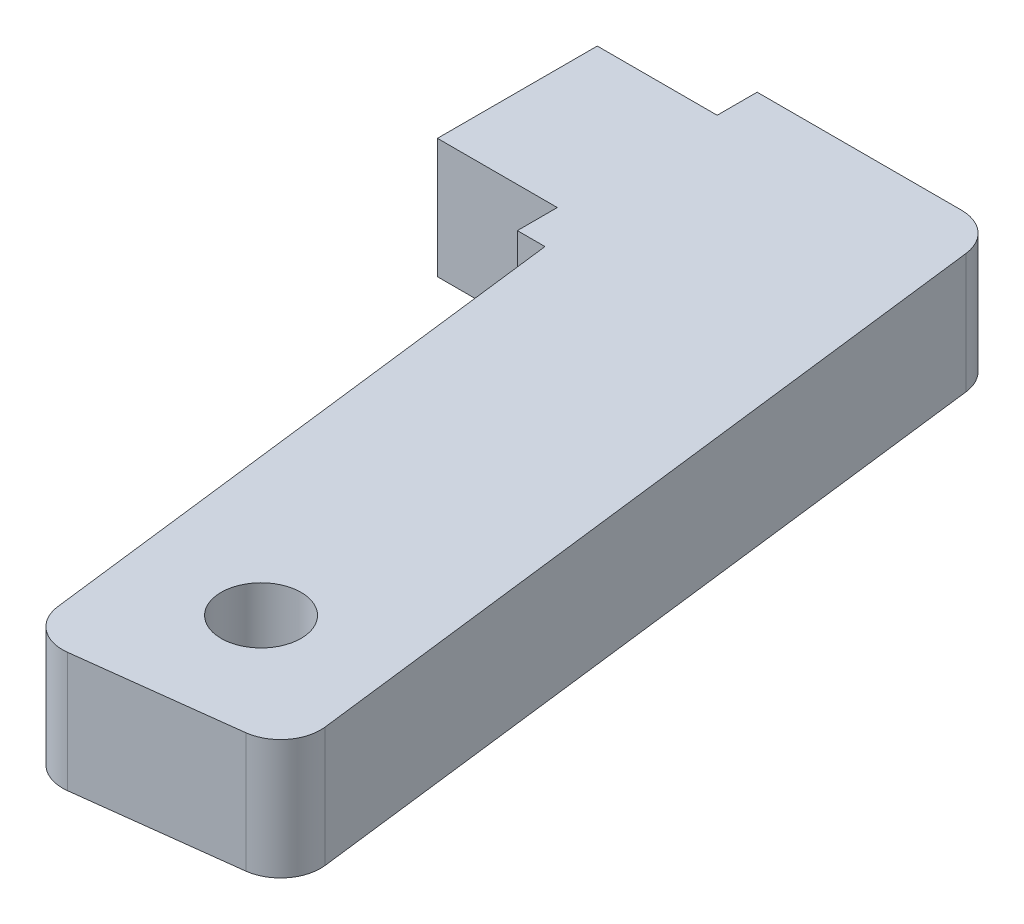
ISO-10303-21;
HEADER;
FILE_DESCRIPTION(('STEP AP214'),'2;1');
FILE_NAME('part.step','',(''),(''),'','','');
FILE_SCHEMA(('AUTOMOTIVE_DESIGN { 1 0 10303 214 1 1 1 1 }'));
ENDSEC;
DATA;
#1=APPLICATION_CONTEXT('core data for automotive mechanical design processes');
#2=APPLICATION_PROTOCOL_DEFINITION('international standard','automotive_design',2000,#1);
#3=PRODUCT_CONTEXT('',#1,'mechanical');
#4=PRODUCT('Part','Part','',(#3));
#5=PRODUCT_RELATED_PRODUCT_CATEGORY('part','',(#4));
#6=PRODUCT_DEFINITION_FORMATION('','',#4);
#7=PRODUCT_DEFINITION_CONTEXT('part definition',#1,'design');
#8=PRODUCT_DEFINITION('design','',#6,#7);
#9=PRODUCT_DEFINITION_SHAPE('','',#8);
#10=(LENGTH_UNIT() NAMED_UNIT(*) SI_UNIT(.MILLI.,.METRE.));
#11=(NAMED_UNIT(*) PLANE_ANGLE_UNIT() SI_UNIT($,.RADIAN.));
#12=(NAMED_UNIT(*) SI_UNIT($,.STERADIAN.) SOLID_ANGLE_UNIT());
#13=UNCERTAINTY_MEASURE_WITH_UNIT(LENGTH_MEASURE(1.E-05),#10,'distance_accuracy_value','');
#14=(GEOMETRIC_REPRESENTATION_CONTEXT(3) GLOBAL_UNCERTAINTY_ASSIGNED_CONTEXT((#13)) GLOBAL_UNIT_ASSIGNED_CONTEXT((#10,
#11,#12)) REPRESENTATION_CONTEXT('',''));
#15=CARTESIAN_POINT('',(0.,0.,0.));
#16=DIRECTION('',(0.,0.,1.));
#17=DIRECTION('',(1.,0.,0.));
#18=AXIS2_PLACEMENT_3D('',#15,#16,#17);
#19=CARTESIAN_POINT('',(0.,3.,0.));
#20=DIRECTION('',(0.,-1.,0.));
#21=DIRECTION('',(0.,0.,-1.));
#22=AXIS2_PLACEMENT_3D('',#19,#20,#21);
#23=PLANE('',#22);
#24=DIRECTION('',(0.121869343405144,0.,0.992546151641322));
#25=VECTOR('',#24,1.);
#26=CARTESIAN_POINT('',(15.4398871595285,3.,-13.9333416231385));
#27=LINE('',#26,#25);
#28=CARTESIAN_POINT('',(15.4398871595285,3.,-13.9333416231385));
#29=VERTEX_POINT('',#28);
#30=CARTESIAN_POINT('',(17.1460579672006,3.,-0.0376955001600201));
#31=VERTEX_POINT('',#30);
#32=EDGE_CURVE('E288',#29,#31,#27,.T.);
#33=ORIENTED_EDGE('',*,*,#32,.T.);
#34=CARTESIAN_POINT('',(18.1386041188419,3.,-0.159564843565165));
#35=DIRECTION('',(0.,-1.,0.));
#36=DIRECTION('',(0.,0.,-1.));
#37=AXIS2_PLACEMENT_3D('',#34,#35,#36);
#38=CIRCLE('',#37,1.);
#39=CARTESIAN_POINT('',(18.260473462247,3.,0.832981308076158));
#40=VERTEX_POINT('',#39);
#41=EDGE_CURVE('E199',#31,#40,#38,.F.);
#42=ORIENTED_EDGE('',*,*,#41,.T.);
#43=DIRECTION('',(0.992546151641322,0.,-0.121869343405144));
#44=VECTOR('',#43,1.);
#45=CARTESIAN_POINT('',(17.2679273106057,3.,0.954850651481302));
#46=LINE('',#45,#44);
#47=CARTESIAN_POINT('',(22.2306580688123,3.,0.34550393445558));
#48=VERTEX_POINT('',#47);
#49=EDGE_CURVE('E287',#40,#48,#46,.T.);
#50=ORIENTED_EDGE('',*,*,#49,.T.);
#51=CARTESIAN_POINT('',(22.1087887254072,3.,-0.647042217185743));
#52=DIRECTION('',(0.,-1.,0.));
#53=DIRECTION('',(0.,0.,-1.));
#54=AXIS2_PLACEMENT_3D('',#51,#52,#53);
#55=CIRCLE('',#54,1.);
#56=CARTESIAN_POINT('',(23.1013348770485,3.,-0.768911560590887));
#57=VERTEX_POINT('',#56);
#58=EDGE_CURVE('E196',#48,#57,#55,.F.);
#59=ORIENTED_EDGE('',*,*,#58,.T.);
#60=DIRECTION('',(-0.121869343405145,0.,-0.992546151641322));
#61=VECTOR('',#60,1.);
#62=CARTESIAN_POINT('',(23.2232042204536,3.,0.223634591050435));
#63=LINE('',#62,#61);
#64=CARTESIAN_POINT('',(20.8560596339496,3.,-19.0552109665437));
#65=VERTEX_POINT('',#64);
#66=EDGE_CURVE('E211',#57,#65,#63,.T.);
#67=ORIENTED_EDGE('',*,*,#66,.T.);
#68=CARTESIAN_POINT('',(19.8635134823083,3.,-18.9333416231385));
#69=DIRECTION('',(0.,-1.,0.));
#70=DIRECTION('',(0.,0.,-1.));
#71=AXIS2_PLACEMENT_3D('',#68,#69,#70);
#72=CIRCLE('',#71,1.);
#73=CARTESIAN_POINT('',(19.8635134823083,3.,-19.9333416231385));
#74=VERTEX_POINT('',#73);
#75=EDGE_CURVE('E59',#65,#74,#72,.F.);
#76=ORIENTED_EDGE('',*,*,#75,.T.);
#77=DIRECTION('',(-1.,0.,0.));
#78=VECTOR('',#77,1.);
#79=CARTESIAN_POINT('',(20.7482387468642,3.,-19.9333416231385));
#80=LINE('',#79,#78);
#81=CARTESIAN_POINT('',(14.7482387468642,3.,-19.9333416231385));
#82=VERTEX_POINT('',#81);
#83=EDGE_CURVE('E157',#74,#82,#80,.T.);
#84=ORIENTED_EDGE('',*,*,#83,.T.);
#85=DIRECTION('',(0.,0.,1.));
#86=VECTOR('',#85,1.);
#87=CARTESIAN_POINT('',(14.7482387468642,3.,-19.9333416231385));
#88=LINE('',#87,#86);
#89=CARTESIAN_POINT('',(14.7482387468642,3.,-18.9333416231385));
#90=VERTEX_POINT('',#89);
#91=EDGE_CURVE('E152',#82,#90,#88,.T.);
#92=ORIENTED_EDGE('',*,*,#91,.T.);
#93=DIRECTION('',(-1.,0.,0.));
#94=VECTOR('',#93,1.);
#95=CARTESIAN_POINT('',(14.7482387468642,3.,-18.9333416231385));
#96=LINE('',#95,#94);
#97=CARTESIAN_POINT('',(11.7482387468642,3.,-18.9333416231385));
#98=VERTEX_POINT('',#97);
#99=EDGE_CURVE('E141',#90,#98,#96,.T.);
#100=ORIENTED_EDGE('',*,*,#99,.T.);
#101=DIRECTION('',(0.,0.,1.));
#102=VECTOR('',#101,1.);
#103=CARTESIAN_POINT('',(11.7482387468642,3.,-18.9333416231385));
#104=LINE('',#103,#102);
#105=CARTESIAN_POINT('',(11.7482387468642,3.,-14.9333416231385));
#106=VERTEX_POINT('',#105);
#107=EDGE_CURVE('E151',#98,#106,#104,.T.);
#108=ORIENTED_EDGE('',*,*,#107,.T.);
#109=DIRECTION('',(1.,0.,0.));
#110=VECTOR('',#109,1.);
#111=CARTESIAN_POINT('',(11.7482387468642,3.,-14.9333416231385));
#112=LINE('',#111,#110);
#113=CARTESIAN_POINT('',(14.7482387468642,3.,-14.9333416231385));
#114=VERTEX_POINT('',#113);
#115=EDGE_CURVE('E254',#106,#114,#112,.T.);
#116=ORIENTED_EDGE('',*,*,#115,.T.);
#117=DIRECTION('',(0.,0.,1.));
#118=VECTOR('',#117,1.);
#119=CARTESIAN_POINT('',(14.7482387468642,3.,-14.9333416231385));
#120=LINE('',#119,#118);
#121=CARTESIAN_POINT('',(14.7482387468642,3.,-13.9333416231385));
#122=VERTEX_POINT('',#121);
#123=EDGE_CURVE('E309',#114,#122,#120,.T.);
#124=ORIENTED_EDGE('',*,*,#123,.T.);
#125=DIRECTION('',(1.,0.,0.));
#126=VECTOR('',#125,1.);
#127=CARTESIAN_POINT('',(14.7482387468642,3.,-13.9333416231385));
#128=LINE('',#127,#126);
#129=EDGE_CURVE('E298',#122,#29,#128,.T.);
#130=ORIENTED_EDGE('',*,*,#129,.T.);
#131=EDGE_LOOP('',(#33,#42,#50,#59,#67,#76,#84,#92,#100,#108,#116,#124,#130));
#132=FACE_BOUND('',#131,.T.);
#133=CARTESIAN_POINT('',(19.8799577353142,3.,-2.3883958336581));
#134=DIRECTION('',(0.,1.,0.));
#135=DIRECTION('',(0.,0.,1.));
#136=AXIS2_PLACEMENT_3D('',#133,#134,#135);
#137=CIRCLE('',#136,1.);
#138=CARTESIAN_POINT('',(19.8799577353142,3.,-1.3883958336581));
#139=VERTEX_POINT('',#138);
#140=EDGE_CURVE('E304',#139,#139,#137,.T.);
#141=ORIENTED_EDGE('',*,*,#140,.F.);
#142=EDGE_LOOP('',(#141));
#143=FACE_BOUND('',#142,.T.);
#144=ADVANCED_FACE('F43',(#132,#143),#23,.F.);
#145=CARTESIAN_POINT('',(0.,0.,0.));
#146=DIRECTION('',(0.,-1.,0.));
#147=DIRECTION('',(0.,0.,-1.));
#148=AXIS2_PLACEMENT_3D('',#145,#146,#147);
#149=PLANE('',#148);
#150=DIRECTION('',(0.992546151641322,0.,-0.121869343405144));
#151=VECTOR('',#150,1.);
#152=CARTESIAN_POINT('',(17.2679273106057,0.,0.954850651481302));
#153=LINE('',#152,#151);
#154=CARTESIAN_POINT('',(18.260473462247,0.,0.832981308076158));
#155=VERTEX_POINT('',#154);
#156=CARTESIAN_POINT('',(22.2306580688123,0.,0.34550393445558));
#157=VERTEX_POINT('',#156);
#158=EDGE_CURVE('E220',#155,#157,#153,.T.);
#159=ORIENTED_EDGE('',*,*,#158,.F.);
#160=CARTESIAN_POINT('',(18.1386041188419,0.,-0.159564843565165));
#161=DIRECTION('',(0.,-1.,0.));
#162=DIRECTION('',(0.,0.,-1.));
#163=AXIS2_PLACEMENT_3D('',#160,#161,#162);
#164=CIRCLE('',#163,1.);
#165=CARTESIAN_POINT('',(17.1460579672006,0.,-0.0376955001600201));
#166=VERTEX_POINT('',#165);
#167=EDGE_CURVE('E188',#155,#166,#164,.T.);
#168=ORIENTED_EDGE('',*,*,#167,.T.);
#169=DIRECTION('',(0.121869343405144,0.,0.992546151641322));
#170=VECTOR('',#169,1.);
#171=CARTESIAN_POINT('',(15.4398871595285,0.,-13.9333416231385));
#172=LINE('',#171,#170);
#173=CARTESIAN_POINT('',(15.4398871595285,0.,-13.9333416231385));
#174=VERTEX_POINT('',#173);
#175=EDGE_CURVE('E225',#174,#166,#172,.T.);
#176=ORIENTED_EDGE('',*,*,#175,.F.);
#177=DIRECTION('',(1.,0.,0.));
#178=VECTOR('',#177,1.);
#179=CARTESIAN_POINT('',(14.7482387468642,0.,-13.9333416231385));
#180=LINE('',#179,#178);
#181=CARTESIAN_POINT('',(14.7482387468642,0.,-13.9333416231385));
#182=VERTEX_POINT('',#181);
#183=EDGE_CURVE('E265',#182,#174,#180,.T.);
#184=ORIENTED_EDGE('',*,*,#183,.F.);
#185=DIRECTION('',(0.,0.,1.));
#186=VECTOR('',#185,1.);
#187=CARTESIAN_POINT('',(14.7482387468642,0.,-14.9333416231385));
#188=LINE('',#187,#186);
#189=CARTESIAN_POINT('',(14.7482387468642,0.,-14.9333416231385));
#190=VERTEX_POINT('',#189);
#191=EDGE_CURVE('E260',#190,#182,#188,.T.);
#192=ORIENTED_EDGE('',*,*,#191,.F.);
#193=DIRECTION('',(1.,0.,0.));
#194=VECTOR('',#193,1.);
#195=CARTESIAN_POINT('',(11.7482387468642,0.,-14.9333416231385));
#196=LINE('',#195,#194);
#197=CARTESIAN_POINT('',(11.7482387468642,0.,-14.9333416231385));
#198=VERTEX_POINT('',#197);
#199=EDGE_CURVE('E253',#198,#190,#196,.T.);
#200=ORIENTED_EDGE('',*,*,#199,.F.);
#201=DIRECTION('',(0.,0.,1.));
#202=VECTOR('',#201,1.);
#203=CARTESIAN_POINT('',(11.7482387468642,0.,-18.9333416231385));
#204=LINE('',#203,#202);
#205=CARTESIAN_POINT('',(11.7482387468642,0.,-18.9333416231385));
#206=VERTEX_POINT('',#205);
#207=EDGE_CURVE('E258',#206,#198,#204,.T.);
#208=ORIENTED_EDGE('',*,*,#207,.F.);
#209=DIRECTION('',(-1.,0.,0.));
#210=VECTOR('',#209,1.);
#211=CARTESIAN_POINT('',(14.7482387468642,0.,-18.9333416231385));
#212=LINE('',#211,#210);
#213=CARTESIAN_POINT('',(14.7482387468642,0.,-18.9333416231385));
#214=VERTEX_POINT('',#213);
#215=EDGE_CURVE('E268',#214,#206,#212,.T.);
#216=ORIENTED_EDGE('',*,*,#215,.F.);
#217=DIRECTION('',(0.,0.,1.));
#218=VECTOR('',#217,1.);
#219=CARTESIAN_POINT('',(14.7482387468642,0.,-19.9333416231385));
#220=LINE('',#219,#218);
#221=CARTESIAN_POINT('',(14.7482387468642,0.,-19.9333416231385));
#222=VERTEX_POINT('',#221);
#223=EDGE_CURVE('E166',#222,#214,#220,.T.);
#224=ORIENTED_EDGE('',*,*,#223,.F.);
#225=DIRECTION('',(-1.,0.,0.));
#226=VECTOR('',#225,1.);
#227=CARTESIAN_POINT('',(20.7482387468642,0.,-19.9333416231385));
#228=LINE('',#227,#226);
#229=CARTESIAN_POINT('',(19.8635134823083,0.,-19.9333416231385));
#230=VERTEX_POINT('',#229);
#231=EDGE_CURVE('E162',#230,#222,#228,.T.);
#232=ORIENTED_EDGE('',*,*,#231,.F.);
#233=CARTESIAN_POINT('',(19.8635134823083,0.,-18.9333416231385));
#234=DIRECTION('',(0.,-1.,0.));
#235=DIRECTION('',(0.,0.,-1.));
#236=AXIS2_PLACEMENT_3D('',#233,#234,#235);
#237=CIRCLE('',#236,1.);
#238=CARTESIAN_POINT('',(20.8560596339496,0.,-19.0552109665437));
#239=VERTEX_POINT('',#238);
#240=EDGE_CURVE('E182',#230,#239,#237,.T.);
#241=ORIENTED_EDGE('',*,*,#240,.T.);
#242=DIRECTION('',(-0.121869343405145,0.,-0.992546151641322));
#243=VECTOR('',#242,1.);
#244=CARTESIAN_POINT('',(23.2232042204536,0.,0.223634591050435));
#245=LINE('',#244,#243);
#246=CARTESIAN_POINT('',(23.1013348770485,0.,-0.768911560590887));
#247=VERTEX_POINT('',#246);
#248=EDGE_CURVE('E210',#247,#239,#245,.T.);
#249=ORIENTED_EDGE('',*,*,#248,.F.);
#250=CARTESIAN_POINT('',(22.1087887254072,0.,-0.647042217185743));
#251=DIRECTION('',(0.,-1.,0.));
#252=DIRECTION('',(0.,0.,-1.));
#253=AXIS2_PLACEMENT_3D('',#250,#251,#252);
#254=CIRCLE('',#253,1.);
#255=EDGE_CURVE('E185',#247,#157,#254,.T.);
#256=ORIENTED_EDGE('',*,*,#255,.T.);
#257=EDGE_LOOP('',(#159,#168,#176,#184,#192,#200,#208,#216,#224,#232,#241,#249,#256));
#258=FACE_BOUND('',#257,.T.);
#259=CARTESIAN_POINT('',(19.8799577353142,0.,-2.3883958336581));
#260=DIRECTION('',(0.,1.,0.));
#261=DIRECTION('',(0.,0.,1.));
#262=AXIS2_PLACEMENT_3D('',#259,#260,#261);
#263=CIRCLE('',#262,1.);
#264=CARTESIAN_POINT('',(19.8799577353142,0.,-1.3883958336581));
#265=VERTEX_POINT('',#264);
#266=EDGE_CURVE('E473',#265,#265,#263,.T.);
#267=ORIENTED_EDGE('',*,*,#266,.T.);
#268=EDGE_LOOP('',(#267));
#269=FACE_BOUND('',#268,.T.);
#270=ADVANCED_FACE('F216',(#258,#269),#149,.T.);
#271=CARTESIAN_POINT('',(14.7482387468642,3.,-19.9333416231385));
#272=DIRECTION('',(1.,0.,0.));
#273=DIRECTION('',(0.,0.,-1.));
#274=AXIS2_PLACEMENT_3D('',#271,#272,#273);
#275=PLANE('',#274);
#276=ORIENTED_EDGE('',*,*,#223,.T.);
#277=DIRECTION('',(0.,-1.,0.));
#278=VECTOR('',#277,1.);
#279=CARTESIAN_POINT('',(14.7482387468642,3.,-18.9333416231385));
#280=LINE('',#279,#278);
#281=EDGE_CURVE('E145',#90,#214,#280,.T.);
#282=ORIENTED_EDGE('',*,*,#281,.F.);
#283=ORIENTED_EDGE('',*,*,#91,.F.);
#284=DIRECTION('',(0.,-1.,0.));
#285=VECTOR('',#284,1.);
#286=CARTESIAN_POINT('',(14.7482387468642,3.,-19.9333416231385));
#287=LINE('',#286,#285);
#288=EDGE_CURVE('E229',#82,#222,#287,.T.);
#289=ORIENTED_EDGE('',*,*,#288,.T.);
#290=EDGE_LOOP('',(#276,#282,#283,#289));
#291=FACE_BOUND('',#290,.T.);
#292=ADVANCED_FACE('F164',(#291),#275,.F.);
#293=CARTESIAN_POINT('',(14.7482387468642,3.,-18.9333416231385));
#294=DIRECTION('',(0.,0.,1.));
#295=DIRECTION('',(1.,0.,0.));
#296=AXIS2_PLACEMENT_3D('',#293,#294,#295);
#297=PLANE('',#296);
#298=ORIENTED_EDGE('',*,*,#215,.T.);
#299=DIRECTION('',(0.,-1.,0.));
#300=VECTOR('',#299,1.);
#301=CARTESIAN_POINT('',(11.7482387468642,3.,-18.9333416231385));
#302=LINE('',#301,#300);
#303=EDGE_CURVE('E148',#98,#206,#302,.T.);
#304=ORIENTED_EDGE('',*,*,#303,.F.);
#305=ORIENTED_EDGE('',*,*,#99,.F.);
#306=ORIENTED_EDGE('',*,*,#281,.T.);
#307=EDGE_LOOP('',(#298,#304,#305,#306));
#308=FACE_BOUND('',#307,.T.);
#309=ADVANCED_FACE('F143',(#308),#297,.F.);
#310=CARTESIAN_POINT('',(11.7482387468642,3.,-18.9333416231385));
#311=DIRECTION('',(1.,0.,0.));
#312=DIRECTION('',(0.,0.,-1.));
#313=AXIS2_PLACEMENT_3D('',#310,#311,#312);
#314=PLANE('',#313);
#315=ORIENTED_EDGE('',*,*,#207,.T.);
#316=DIRECTION('',(0.,-1.,0.));
#317=VECTOR('',#316,1.);
#318=CARTESIAN_POINT('',(11.7482387468642,3.,-14.9333416231385));
#319=LINE('',#318,#317);
#320=EDGE_CURVE('E175',#106,#198,#319,.T.);
#321=ORIENTED_EDGE('',*,*,#320,.F.);
#322=ORIENTED_EDGE('',*,*,#107,.F.);
#323=ORIENTED_EDGE('',*,*,#303,.T.);
#324=EDGE_LOOP('',(#315,#321,#322,#323));
#325=FACE_BOUND('',#324,.T.);
#326=ADVANCED_FACE('F306',(#325),#314,.F.);
#327=CARTESIAN_POINT('',(11.7482387468642,3.,-14.9333416231385));
#328=DIRECTION('',(0.,0.,-1.));
#329=DIRECTION('',(-1.,0.,0.));
#330=AXIS2_PLACEMENT_3D('',#327,#328,#329);
#331=PLANE('',#330);
#332=ORIENTED_EDGE('',*,*,#199,.T.);
#333=DIRECTION('',(0.,-1.,0.));
#334=VECTOR('',#333,1.);
#335=CARTESIAN_POINT('',(14.7482387468642,3.,-14.9333416231385));
#336=LINE('',#335,#334);
#337=EDGE_CURVE('E240',#114,#190,#336,.T.);
#338=ORIENTED_EDGE('',*,*,#337,.F.);
#339=ORIENTED_EDGE('',*,*,#115,.F.);
#340=ORIENTED_EDGE('',*,*,#320,.T.);
#341=EDGE_LOOP('',(#332,#338,#339,#340));
#342=FACE_BOUND('',#341,.T.);
#343=ADVANCED_FACE('F251',(#342),#331,.F.);
#344=CARTESIAN_POINT('',(14.7482387468642,3.,-14.9333416231385));
#345=DIRECTION('',(1.,0.,0.));
#346=DIRECTION('',(0.,0.,-1.));
#347=AXIS2_PLACEMENT_3D('',#344,#345,#346);
#348=PLANE('',#347);
#349=ORIENTED_EDGE('',*,*,#191,.T.);
#350=DIRECTION('',(0.,-1.,0.));
#351=VECTOR('',#350,1.);
#352=CARTESIAN_POINT('',(14.7482387468642,3.,-13.9333416231385));
#353=LINE('',#352,#351);
#354=EDGE_CURVE('E236',#122,#182,#353,.T.);
#355=ORIENTED_EDGE('',*,*,#354,.F.);
#356=ORIENTED_EDGE('',*,*,#123,.F.);
#357=ORIENTED_EDGE('',*,*,#337,.T.);
#358=EDGE_LOOP('',(#349,#355,#356,#357));
#359=FACE_BOUND('',#358,.T.);
#360=ADVANCED_FACE('F318',(#359),#348,.F.);
#361=CARTESIAN_POINT('',(14.7482387468642,3.,-13.9333416231385));
#362=DIRECTION('',(0.,0.,-1.));
#363=DIRECTION('',(-1.,0.,0.));
#364=AXIS2_PLACEMENT_3D('',#361,#362,#363);
#365=PLANE('',#364);
#366=ORIENTED_EDGE('',*,*,#183,.T.);
#367=DIRECTION('',(0.,-1.,0.));
#368=VECTOR('',#367,1.);
#369=CARTESIAN_POINT('',(15.4398871595285,3.,-13.9333416231385));
#370=LINE('',#369,#368);
#371=EDGE_CURVE('E232',#29,#174,#370,.T.);
#372=ORIENTED_EDGE('',*,*,#371,.F.);
#373=ORIENTED_EDGE('',*,*,#129,.F.);
#374=ORIENTED_EDGE('',*,*,#354,.T.);
#375=EDGE_LOOP('',(#366,#372,#373,#374));
#376=FACE_BOUND('',#375,.T.);
#377=ADVANCED_FACE('F316',(#376),#365,.F.);
#378=CARTESIAN_POINT('',(15.4398871595285,3.,-13.9333416231385));
#379=DIRECTION('',(0.992546151641322,0.,-0.121869343405144));
#380=DIRECTION('',(-0.121869343405144,0.,-0.992546151641322));
#381=AXIS2_PLACEMENT_3D('',#378,#379,#380);
#382=PLANE('',#381);
#383=ORIENTED_EDGE('',*,*,#175,.T.);
#384=DIRECTION('',(0.,-1.,0.));
#385=VECTOR('',#384,1.);
#386=CARTESIAN_POINT('',(17.1460579672006,3.,-0.0376955001600201));
#387=LINE('',#386,#385);
#388=EDGE_CURVE('E191',#166,#31,#387,.F.);
#389=ORIENTED_EDGE('',*,*,#388,.T.);
#390=ORIENTED_EDGE('',*,*,#32,.F.);
#391=ORIENTED_EDGE('',*,*,#371,.T.);
#392=EDGE_LOOP('',(#383,#389,#390,#391));
#393=FACE_BOUND('',#392,.T.);
#394=ADVANCED_FACE('F278',(#393),#382,.F.);
#395=CARTESIAN_POINT('',(17.2679273106057,3.,0.954850651481302));
#396=DIRECTION('',(-0.121869343405144,0.,-0.992546151641322));
#397=DIRECTION('',(-0.992546151641322,0.,0.121869343405144));
#398=AXIS2_PLACEMENT_3D('',#395,#396,#397);
#399=PLANE('',#398);
#400=ORIENTED_EDGE('',*,*,#49,.F.);
#401=DIRECTION('',(0.,-1.,0.));
#402=VECTOR('',#401,1.);
#403=CARTESIAN_POINT('',(18.260473462247,3.,0.832981308076158));
#404=LINE('',#403,#402);
#405=EDGE_CURVE('E172',#40,#155,#404,.T.);
#406=ORIENTED_EDGE('',*,*,#405,.T.);
#407=ORIENTED_EDGE('',*,*,#158,.T.);
#408=DIRECTION('',(0.,-1.,0.));
#409=VECTOR('',#408,1.);
#410=CARTESIAN_POINT('',(22.2306580688123,3.,0.34550393445558));
#411=LINE('',#410,#409);
#412=EDGE_CURVE('E168',#157,#48,#411,.F.);
#413=ORIENTED_EDGE('',*,*,#412,.T.);
#414=EDGE_LOOP('',(#400,#406,#407,#413));
#415=FACE_BOUND('',#414,.T.);
#416=ADVANCED_FACE('F290',(#415),#399,.F.);
#417=CARTESIAN_POINT('',(23.2232042204536,3.,0.223634591050435));
#418=DIRECTION('',(-0.992546151641322,0.,0.121869343405145));
#419=DIRECTION('',(0.121869343405145,0.,0.992546151641322));
#420=AXIS2_PLACEMENT_3D('',#417,#418,#419);
#421=PLANE('',#420);
#422=ORIENTED_EDGE('',*,*,#66,.F.);
#423=DIRECTION('',(0.,-1.,0.));
#424=VECTOR('',#423,1.);
#425=CARTESIAN_POINT('',(23.1013348770485,3.,-0.768911560590887));
#426=LINE('',#425,#424);
#427=EDGE_CURVE('E52',#57,#247,#426,.T.);
#428=ORIENTED_EDGE('',*,*,#427,.T.);
#429=ORIENTED_EDGE('',*,*,#248,.T.);
#430=DIRECTION('',(0.,-1.,0.));
#431=VECTOR('',#430,1.);
#432=CARTESIAN_POINT('',(20.8560596339496,3.,-19.0552109665437));
#433=LINE('',#432,#431);
#434=EDGE_CURVE('E67',#239,#65,#433,.F.);
#435=ORIENTED_EDGE('',*,*,#434,.T.);
#436=EDGE_LOOP('',(#422,#428,#429,#435));
#437=FACE_BOUND('',#436,.T.);
#438=ADVANCED_FACE('F209',(#437),#421,.F.);
#439=CARTESIAN_POINT('',(20.7482387468642,3.,-19.9333416231385));
#440=DIRECTION('',(0.,0.,1.));
#441=DIRECTION('',(1.,0.,0.));
#442=AXIS2_PLACEMENT_3D('',#439,#440,#441);
#443=PLANE('',#442);
#444=ORIENTED_EDGE('',*,*,#83,.F.);
#445=DIRECTION('',(0.,-1.,0.));
#446=VECTOR('',#445,1.);
#447=CARTESIAN_POINT('',(19.8635134823083,3.,-19.9333416231385));
#448=LINE('',#447,#446);
#449=EDGE_CURVE('E11',#74,#230,#448,.T.);
#450=ORIENTED_EDGE('',*,*,#449,.T.);
#451=ORIENTED_EDGE('',*,*,#231,.T.);
#452=ORIENTED_EDGE('',*,*,#288,.F.);
#453=EDGE_LOOP('',(#444,#450,#451,#452));
#454=FACE_BOUND('',#453,.T.);
#455=ADVANCED_FACE('F334',(#454),#443,.F.);
#456=CARTESIAN_POINT('',(19.8799577353142,3.,-2.3883958336581));
#457=DIRECTION('',(0.,-1.,0.));
#458=DIRECTION('',(0.,0.,-1.));
#459=AXIS2_PLACEMENT_3D('',#456,#457,#458);
#460=CYLINDRICAL_SURFACE('',#459,1.);
#461=ORIENTED_EDGE('',*,*,#140,.T.);
#462=EDGE_LOOP('',(#461));
#463=FACE_BOUND('',#462,.T.);
#464=ORIENTED_EDGE('',*,*,#266,.F.);
#465=EDGE_LOOP('',(#464));
#466=FACE_BOUND('',#465,.T.);
#467=ADVANCED_FACE('F332',(#463,#466),#460,.F.);
#468=CARTESIAN_POINT('',(18.1386041188419,3.,-0.159564843565165));
#469=DIRECTION('',(0.,-1.,0.));
#470=DIRECTION('',(0.,0.,-1.));
#471=AXIS2_PLACEMENT_3D('',#468,#469,#470);
#472=CYLINDRICAL_SURFACE('',#471,1.);
#473=ORIENTED_EDGE('',*,*,#41,.F.);
#474=ORIENTED_EDGE('',*,*,#388,.F.);
#475=ORIENTED_EDGE('',*,*,#167,.F.);
#476=ORIENTED_EDGE('',*,*,#405,.F.);
#477=EDGE_LOOP('',(#473,#474,#475,#476));
#478=FACE_BOUND('',#477,.T.);
#479=ADVANCED_FACE('F283',(#478),#472,.T.);
#480=CARTESIAN_POINT('',(22.1087887254072,3.,-0.647042217185743));
#481=DIRECTION('',(0.,-1.,0.));
#482=DIRECTION('',(0.,0.,-1.));
#483=AXIS2_PLACEMENT_3D('',#480,#481,#482);
#484=CYLINDRICAL_SURFACE('',#483,1.);
#485=ORIENTED_EDGE('',*,*,#58,.F.);
#486=ORIENTED_EDGE('',*,*,#412,.F.);
#487=ORIENTED_EDGE('',*,*,#255,.F.);
#488=ORIENTED_EDGE('',*,*,#427,.F.);
#489=EDGE_LOOP('',(#485,#486,#487,#488));
#490=FACE_BOUND('',#489,.T.);
#491=ADVANCED_FACE('F365',(#490),#484,.T.);
#492=CARTESIAN_POINT('',(19.8635134823083,3.,-18.9333416231385));
#493=DIRECTION('',(0.,-1.,0.));
#494=DIRECTION('',(0.,0.,-1.));
#495=AXIS2_PLACEMENT_3D('',#492,#493,#494);
#496=CYLINDRICAL_SURFACE('',#495,1.);
#497=ORIENTED_EDGE('',*,*,#75,.F.);
#498=ORIENTED_EDGE('',*,*,#434,.F.);
#499=ORIENTED_EDGE('',*,*,#240,.F.);
#500=ORIENTED_EDGE('',*,*,#449,.F.);
#501=EDGE_LOOP('',(#497,#498,#499,#500));
#502=FACE_BOUND('',#501,.T.);
#503=ADVANCED_FACE('F45',(#502),#496,.T.);
#504=CLOSED_SHELL('',(#144,#270,#292,#309,#326,#343,#360,#377,#394,#416,#438,#455,#467,#479,
#491,#503));
#505=MANIFOLD_SOLID_BREP('B2',#504);
#506=ADVANCED_BREP_SHAPE_REPRESENTATION('',(#18,#505),#14);
#507=SHAPE_DEFINITION_REPRESENTATION(#9,#506);
ENDSEC;
END-ISO-10303-21;
